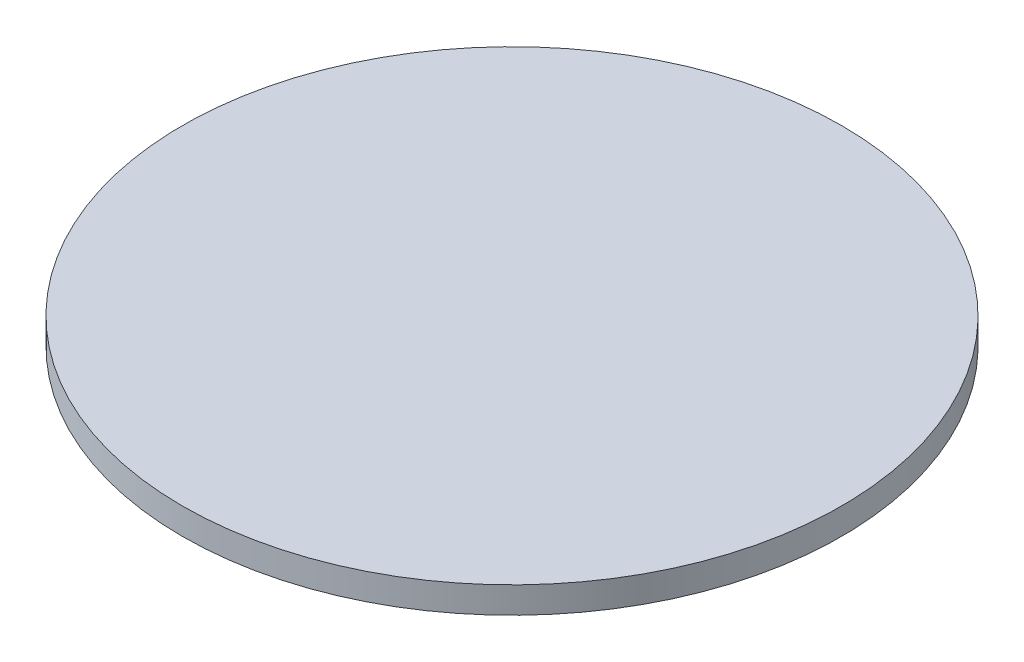
ISO-10303-21;
HEADER;
FILE_DESCRIPTION(('STEP AP214'),'2;1');
FILE_NAME('part.step','',(''),(''),'','','');
FILE_SCHEMA(('AUTOMOTIVE_DESIGN { 1 0 10303 214 1 1 1 1 }'));
ENDSEC;
DATA;
#1=APPLICATION_CONTEXT('core data for automotive mechanical design processes');
#2=APPLICATION_PROTOCOL_DEFINITION('international standard','automotive_design',2000,#1);
#3=PRODUCT_CONTEXT('',#1,'mechanical');
#4=PRODUCT('Part','Part','',(#3));
#5=PRODUCT_RELATED_PRODUCT_CATEGORY('part','',(#4));
#6=PRODUCT_DEFINITION_FORMATION('','',#4);
#7=PRODUCT_DEFINITION_CONTEXT('part definition',#1,'design');
#8=PRODUCT_DEFINITION('design','',#6,#7);
#9=PRODUCT_DEFINITION_SHAPE('','',#8);
#10=(LENGTH_UNIT() NAMED_UNIT(*) SI_UNIT(.MILLI.,.METRE.));
#11=(NAMED_UNIT(*) PLANE_ANGLE_UNIT() SI_UNIT($,.RADIAN.));
#12=(NAMED_UNIT(*) SI_UNIT($,.STERADIAN.) SOLID_ANGLE_UNIT());
#13=UNCERTAINTY_MEASURE_WITH_UNIT(LENGTH_MEASURE(1.E-05),#10,'distance_accuracy_value','');
#14=(GEOMETRIC_REPRESENTATION_CONTEXT(3) GLOBAL_UNCERTAINTY_ASSIGNED_CONTEXT((#13)) GLOBAL_UNIT_ASSIGNED_CONTEXT((#10,
#11,#12)) REPRESENTATION_CONTEXT('',''));
#15=CARTESIAN_POINT('',(0.,0.,0.));
#16=DIRECTION('',(0.,0.,1.));
#17=DIRECTION('',(1.,0.,0.));
#18=AXIS2_PLACEMENT_3D('',#15,#16,#17);
#19=CARTESIAN_POINT('',(0.,10.,0.));
#20=DIRECTION('',(0.,-1.,0.));
#21=DIRECTION('',(0.,0.,-1.));
#22=AXIS2_PLACEMENT_3D('',#19,#20,#21);
#23=CYLINDRICAL_SURFACE('',#22,125.);
#24=CARTESIAN_POINT('',(0.,10.,0.));
#25=DIRECTION('',(0.,1.,0.));
#26=DIRECTION('',(0.,0.,1.));
#27=AXIS2_PLACEMENT_3D('',#24,#25,#26);
#28=CIRCLE('',#27,125.);
#29=CARTESIAN_POINT('',(0.,10.,125.));
#30=VERTEX_POINT('',#29);
#31=EDGE_CURVE('E10',#30,#30,#28,.T.);
#32=ORIENTED_EDGE('',*,*,#31,.F.);
#33=EDGE_LOOP('',(#32));
#34=FACE_BOUND('',#33,.T.);
#35=CARTESIAN_POINT('',(0.,0.,0.));
#36=DIRECTION('',(0.,1.,0.));
#37=DIRECTION('',(0.,0.,1.));
#38=AXIS2_PLACEMENT_3D('',#35,#36,#37);
#39=CIRCLE('',#38,125.);
#40=CARTESIAN_POINT('',(0.,0.,125.));
#41=VERTEX_POINT('',#40);
#42=EDGE_CURVE('E41',#41,#41,#39,.T.);
#43=ORIENTED_EDGE('',*,*,#42,.T.);
#44=EDGE_LOOP('',(#43));
#45=FACE_BOUND('',#44,.T.);
#46=ADVANCED_FACE('F38',(#34,#45),#23,.T.);
#47=CARTESIAN_POINT('',(0.,10.,0.));
#48=DIRECTION('',(0.,1.,0.));
#49=DIRECTION('',(0.,0.,1.));
#50=AXIS2_PLACEMENT_3D('',#47,#48,#49);
#51=PLANE('',#50);
#52=ORIENTED_EDGE('',*,*,#31,.T.);
#53=EDGE_LOOP('',(#52));
#54=FACE_BOUND('',#53,.T.);
#55=ADVANCED_FACE('F53',(#54),#51,.T.);
#56=CARTESIAN_POINT('',(0.,0.,0.));
#57=DIRECTION('',(0.,1.,0.));
#58=DIRECTION('',(0.,0.,1.));
#59=AXIS2_PLACEMENT_3D('',#56,#57,#58);
#60=PLANE('',#59);
#61=ORIENTED_EDGE('',*,*,#42,.F.);
#62=EDGE_LOOP('',(#61));
#63=FACE_BOUND('',#62,.T.);
#64=ADVANCED_FACE('F51',(#63),#60,.F.);
#65=CLOSED_SHELL('',(#46,#55,#64));
#66=MANIFOLD_SOLID_BREP('B2',#65);
#67=ADVANCED_BREP_SHAPE_REPRESENTATION('',(#18,#66),#14);
#68=SHAPE_DEFINITION_REPRESENTATION(#9,#67);
ENDSEC;
END-ISO-10303-21;
